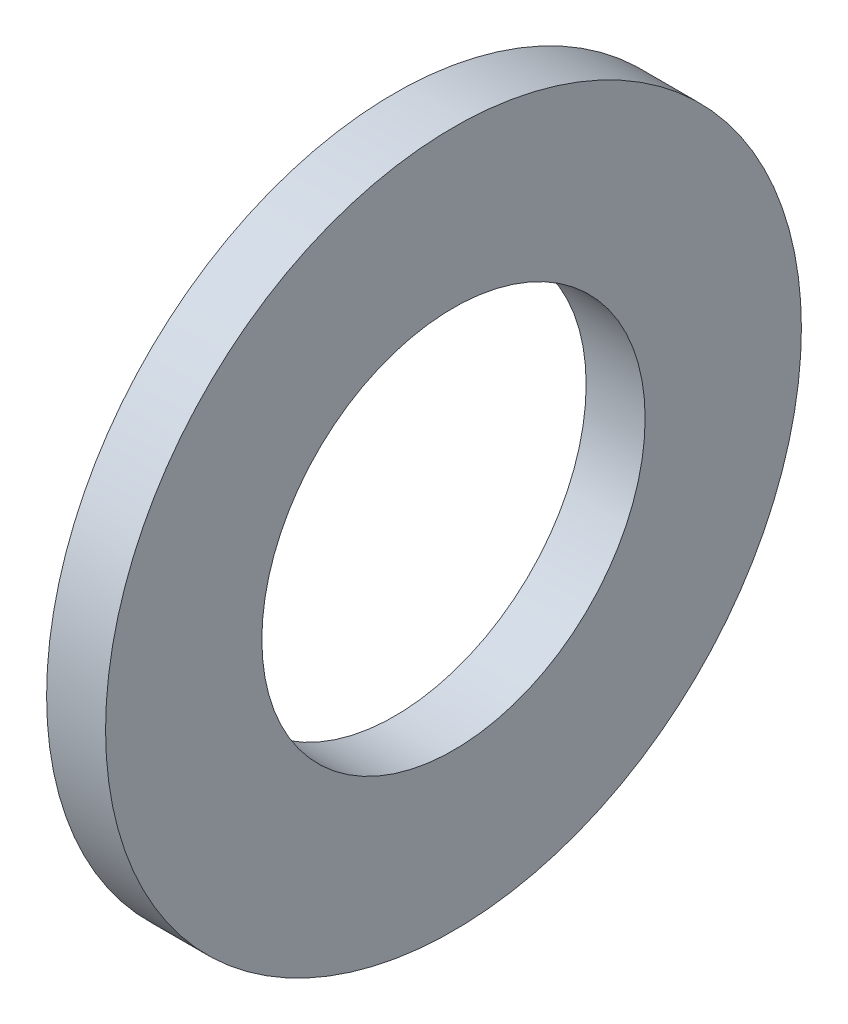
ISO-10303-21;
HEADER;
FILE_DESCRIPTION(('STEP AP214'),'2;1');
FILE_NAME('part.step','',(''),(''),'','','');
FILE_SCHEMA(('AUTOMOTIVE_DESIGN { 1 0 10303 214 1 1 1 1 }'));
ENDSEC;
DATA;
#1=APPLICATION_CONTEXT('core data for automotive mechanical design processes');
#2=APPLICATION_PROTOCOL_DEFINITION('international standard','automotive_design',2000,#1);
#3=PRODUCT_CONTEXT('',#1,'mechanical');
#4=PRODUCT('Part','Part','',(#3));
#5=PRODUCT_RELATED_PRODUCT_CATEGORY('part','',(#4));
#6=PRODUCT_DEFINITION_FORMATION('','',#4);
#7=PRODUCT_DEFINITION_CONTEXT('part definition',#1,'design');
#8=PRODUCT_DEFINITION('design','',#6,#7);
#9=PRODUCT_DEFINITION_SHAPE('','',#8);
#10=(LENGTH_UNIT() NAMED_UNIT(*) SI_UNIT(.MILLI.,.METRE.));
#11=(NAMED_UNIT(*) PLANE_ANGLE_UNIT() SI_UNIT($,.RADIAN.));
#12=(NAMED_UNIT(*) SI_UNIT($,.STERADIAN.) SOLID_ANGLE_UNIT());
#13=UNCERTAINTY_MEASURE_WITH_UNIT(LENGTH_MEASURE(1.E-05),#10,'distance_accuracy_value','');
#14=(GEOMETRIC_REPRESENTATION_CONTEXT(3) GLOBAL_UNCERTAINTY_ASSIGNED_CONTEXT((#13)) GLOBAL_UNIT_ASSIGNED_CONTEXT((#10,
#11,#12)) REPRESENTATION_CONTEXT('',''));
#15=CARTESIAN_POINT('',(0.,0.,0.));
#16=DIRECTION('',(0.,0.,1.));
#17=DIRECTION('',(1.,0.,0.));
#18=AXIS2_PLACEMENT_3D('',#15,#16,#17);
#19=CARTESIAN_POINT('',(1.,0.,0.));
#20=DIRECTION('',(1.,0.,0.));
#21=DIRECTION('',(0.,0.,-1.));
#22=AXIS2_PLACEMENT_3D('',#19,#20,#21);
#23=PLANE('',#22);
#24=CARTESIAN_POINT('',(1.,0.,0.));
#25=DIRECTION('',(1.,0.,0.));
#26=DIRECTION('',(0.,0.,-1.));
#27=AXIS2_PLACEMENT_3D('',#24,#25,#26);
#28=CIRCLE('',#27,5.9);
#29=CARTESIAN_POINT('',(1.,0.,-5.9));
#30=VERTEX_POINT('',#29);
#31=EDGE_CURVE('E10',#30,#30,#28,.T.);
#32=ORIENTED_EDGE('',*,*,#31,.T.);
#33=EDGE_LOOP('',(#32));
#34=FACE_BOUND('',#33,.T.);
#35=CARTESIAN_POINT('',(1.,0.,0.));
#36=DIRECTION('',(1.,0.,0.));
#37=DIRECTION('',(0.,0.,-1.));
#38=AXIS2_PLACEMENT_3D('',#35,#36,#37);
#39=CIRCLE('',#38,3.25);
#40=CARTESIAN_POINT('',(1.,0.,-3.25));
#41=VERTEX_POINT('',#40);
#42=EDGE_CURVE('E41',#41,#41,#39,.T.);
#43=ORIENTED_EDGE('',*,*,#42,.F.);
#44=EDGE_LOOP('',(#43));
#45=FACE_BOUND('',#44,.T.);
#46=ADVANCED_FACE('F30',(#34,#45),#23,.T.);
#47=CARTESIAN_POINT('',(0.,0.,0.));
#48=DIRECTION('',(1.,0.,0.));
#49=DIRECTION('',(0.,0.,-1.));
#50=AXIS2_PLACEMENT_3D('',#47,#48,#49);
#51=PLANE('',#50);
#52=CARTESIAN_POINT('',(0.,0.,0.));
#53=DIRECTION('',(1.,0.,0.));
#54=DIRECTION('',(0.,0.,-1.));
#55=AXIS2_PLACEMENT_3D('',#52,#53,#54);
#56=CIRCLE('',#55,5.9);
#57=CARTESIAN_POINT('',(0.,0.,-5.9));
#58=VERTEX_POINT('',#57);
#59=EDGE_CURVE('E34',#58,#58,#56,.T.);
#60=ORIENTED_EDGE('',*,*,#59,.F.);
#61=EDGE_LOOP('',(#60));
#62=FACE_BOUND('',#61,.T.);
#63=CARTESIAN_POINT('',(0.,0.,0.));
#64=DIRECTION('',(1.,0.,0.));
#65=DIRECTION('',(0.,0.,-1.));
#66=AXIS2_PLACEMENT_3D('',#63,#64,#65);
#67=CIRCLE('',#66,3.25);
#68=CARTESIAN_POINT('',(0.,0.,-3.25));
#69=VERTEX_POINT('',#68);
#70=EDGE_CURVE('E43',#69,#69,#67,.T.);
#71=ORIENTED_EDGE('',*,*,#70,.T.);
#72=EDGE_LOOP('',(#71));
#73=FACE_BOUND('',#72,.T.);
#74=ADVANCED_FACE('F53',(#62,#73),#51,.F.);
#75=CARTESIAN_POINT('',(1.,0.,0.));
#76=DIRECTION('',(-1.,0.,0.));
#77=DIRECTION('',(0.,0.,1.));
#78=AXIS2_PLACEMENT_3D('',#75,#76,#77);
#79=CYLINDRICAL_SURFACE('',#78,5.9);
#80=ORIENTED_EDGE('',*,*,#31,.F.);
#81=EDGE_LOOP('',(#80));
#82=FACE_BOUND('',#81,.T.);
#83=ORIENTED_EDGE('',*,*,#59,.T.);
#84=EDGE_LOOP('',(#83));
#85=FACE_BOUND('',#84,.T.);
#86=ADVANCED_FACE('F32',(#82,#85),#79,.T.);
#87=CARTESIAN_POINT('',(1.,0.,0.));
#88=DIRECTION('',(-1.,0.,0.));
#89=DIRECTION('',(0.,0.,1.));
#90=AXIS2_PLACEMENT_3D('',#87,#88,#89);
#91=CYLINDRICAL_SURFACE('',#90,3.25);
#92=ORIENTED_EDGE('',*,*,#42,.T.);
#93=EDGE_LOOP('',(#92));
#94=FACE_BOUND('',#93,.T.);
#95=ORIENTED_EDGE('',*,*,#70,.F.);
#96=EDGE_LOOP('',(#95));
#97=FACE_BOUND('',#96,.T.);
#98=ADVANCED_FACE('F49',(#94,#97),#91,.F.);
#99=CLOSED_SHELL('',(#46,#74,#86,#98));
#100=MANIFOLD_SOLID_BREP('B2',#99);
#101=ADVANCED_BREP_SHAPE_REPRESENTATION('',(#18,#100),#14);
#102=SHAPE_DEFINITION_REPRESENTATION(#9,#101);
ENDSEC;
END-ISO-10303-21;
